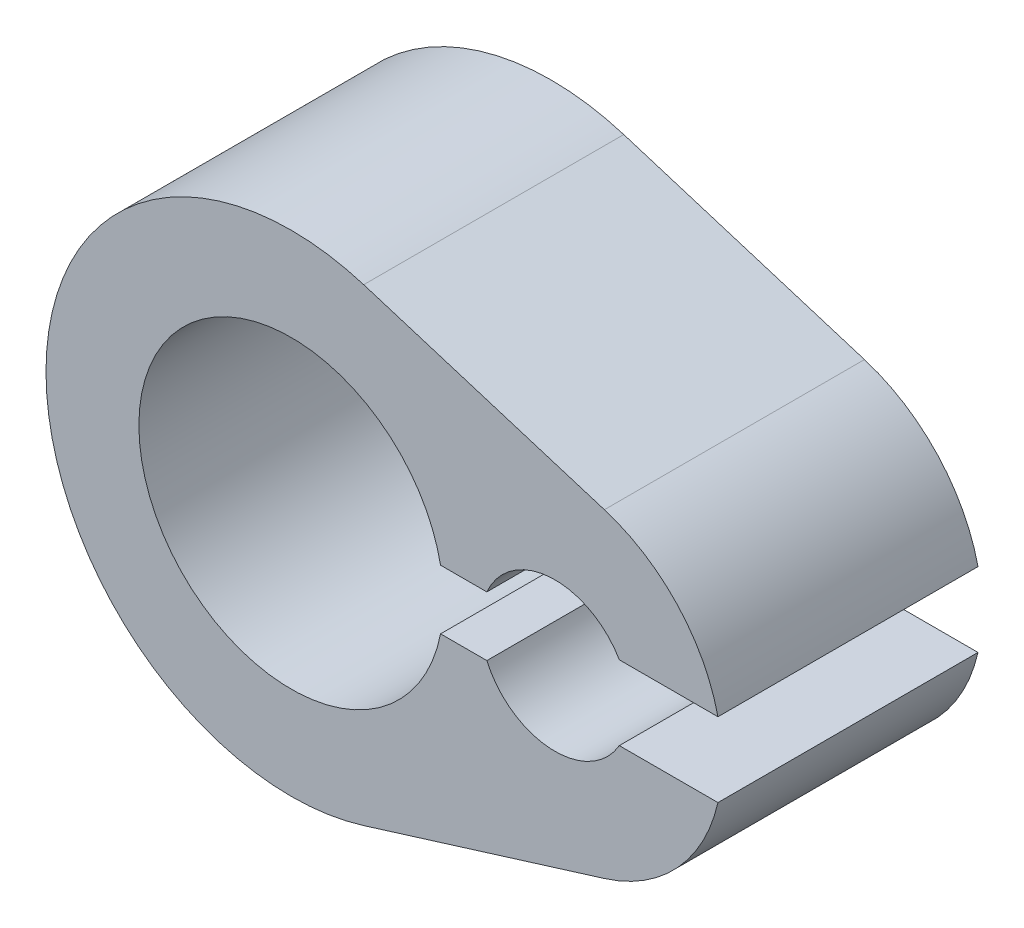
ISO-10303-21;
HEADER;
FILE_DESCRIPTION(('STEP AP214'),'2;1');
FILE_NAME('part.step','',(''),(''),'','','');
FILE_SCHEMA(('AUTOMOTIVE_DESIGN { 1 0 10303 214 1 1 1 1 }'));
ENDSEC;
DATA;
#1=APPLICATION_CONTEXT('core data for automotive mechanical design processes');
#2=APPLICATION_PROTOCOL_DEFINITION('international standard','automotive_design',2000,#1);
#3=PRODUCT_CONTEXT('',#1,'mechanical');
#4=PRODUCT('Part','Part','',(#3));
#5=PRODUCT_RELATED_PRODUCT_CATEGORY('part','',(#4));
#6=PRODUCT_DEFINITION_FORMATION('','',#4);
#7=PRODUCT_DEFINITION_CONTEXT('part definition',#1,'design');
#8=PRODUCT_DEFINITION('design','',#6,#7);
#9=PRODUCT_DEFINITION_SHAPE('','',#8);
#10=(LENGTH_UNIT() NAMED_UNIT(*) SI_UNIT(.MILLI.,.METRE.));
#11=(NAMED_UNIT(*) PLANE_ANGLE_UNIT() SI_UNIT($,.RADIAN.));
#12=(NAMED_UNIT(*) SI_UNIT($,.STERADIAN.) SOLID_ANGLE_UNIT());
#13=UNCERTAINTY_MEASURE_WITH_UNIT(LENGTH_MEASURE(1.E-05),#10,'distance_accuracy_value','');
#14=(GEOMETRIC_REPRESENTATION_CONTEXT(3) GLOBAL_UNCERTAINTY_ASSIGNED_CONTEXT((#13)) GLOBAL_UNIT_ASSIGNED_CONTEXT((#10,
#11,#12)) REPRESENTATION_CONTEXT('',''));
#15=CARTESIAN_POINT('',(0.,0.,0.));
#16=DIRECTION('',(0.,0.,1.));
#17=DIRECTION('',(1.,0.,0.));
#18=AXIS2_PLACEMENT_3D('',#15,#16,#17);
#19=CARTESIAN_POINT('',(7.1,0.,7.));
#20=DIRECTION('',(0.,0.,-1.));
#21=DIRECTION('',(-1.,0.,0.));
#22=AXIS2_PLACEMENT_3D('',#19,#20,#21);
#23=CYLINDRICAL_SURFACE('',#22,2.);
#24=CARTESIAN_POINT('',(7.1,0.,0.));
#25=DIRECTION('',(0.,0.,-1.));
#26=DIRECTION('',(1.,0.,0.));
#27=AXIS2_PLACEMENT_3D('',#24,#25,#26);
#28=CIRCLE('',#27,2.);
#29=CARTESIAN_POINT('',(5.26696972201766,0.8,0.));
#30=VERTEX_POINT('',#29);
#31=CARTESIAN_POINT('',(8.83205080756888,0.999999999999999,0.));
#32=VERTEX_POINT('',#31);
#33=EDGE_CURVE('E152',#30,#32,#28,.T.);
#34=ORIENTED_EDGE('',*,*,#33,.T.);
#35=DIRECTION('',(0.,0.,-1.));
#36=VECTOR('',#35,1.);
#37=CARTESIAN_POINT('',(8.83205080756888,0.999999999999999,7.));
#38=LINE('',#37,#36);
#39=CARTESIAN_POINT('',(8.83205080756888,0.999999999999999,7.));
#40=VERTEX_POINT('',#39);
#41=EDGE_CURVE('E11',#40,#32,#38,.T.);
#42=ORIENTED_EDGE('',*,*,#41,.F.);
#43=CARTESIAN_POINT('',(7.1,0.,7.));
#44=DIRECTION('',(0.,0.,-1.));
#45=DIRECTION('',(1.,0.,0.));
#46=AXIS2_PLACEMENT_3D('',#43,#44,#45);
#47=CIRCLE('',#46,2.);
#48=CARTESIAN_POINT('',(5.26696972201766,0.8,7.));
#49=VERTEX_POINT('',#48);
#50=EDGE_CURVE('E174',#49,#40,#47,.T.);
#51=ORIENTED_EDGE('',*,*,#50,.F.);
#52=DIRECTION('',(0.,0.,-1.));
#53=VECTOR('',#52,1.);
#54=CARTESIAN_POINT('',(5.26696972201766,0.8,7.));
#55=LINE('',#54,#53);
#56=EDGE_CURVE('E148',#49,#30,#55,.T.);
#57=ORIENTED_EDGE('',*,*,#56,.T.);
#58=EDGE_LOOP('',(#34,#42,#51,#57));
#59=FACE_BOUND('',#58,.T.);
#60=ADVANCED_FACE('F32',(#59),#23,.F.);
#61=CARTESIAN_POINT('',(8.83205080756888,0.999999999999999,7.));
#62=DIRECTION('',(0.,1.,0.));
#63=DIRECTION('',(-1.,0.,0.));
#64=AXIS2_PLACEMENT_3D('',#61,#62,#63);
#65=PLANE('',#64);
#66=DIRECTION('',(1.,0.,0.));
#67=VECTOR('',#66,1.);
#68=CARTESIAN_POINT('',(8.83205080756888,0.999999999999999,0.));
#69=LINE('',#68,#67);
#70=CARTESIAN_POINT('',(11.4874821936961,1.,0.));
#71=VERTEX_POINT('',#70);
#72=EDGE_CURVE('E155',#32,#71,#69,.T.);
#73=ORIENTED_EDGE('',*,*,#72,.T.);
#74=DIRECTION('',(0.,0.,-1.));
#75=VECTOR('',#74,1.);
#76=CARTESIAN_POINT('',(11.4874821936961,1.,7.));
#77=LINE('',#76,#75);
#78=CARTESIAN_POINT('',(11.4874821936961,1.,7.));
#79=VERTEX_POINT('',#78);
#80=EDGE_CURVE('E40',#79,#71,#77,.T.);
#81=ORIENTED_EDGE('',*,*,#80,.F.);
#82=DIRECTION('',(1.,0.,0.));
#83=VECTOR('',#82,1.);
#84=CARTESIAN_POINT('',(8.83205080756888,0.999999999999999,7.));
#85=LINE('',#84,#83);
#86=EDGE_CURVE('E103',#40,#79,#85,.T.);
#87=ORIENTED_EDGE('',*,*,#86,.F.);
#88=ORIENTED_EDGE('',*,*,#41,.T.);
#89=EDGE_LOOP('',(#73,#81,#87,#88));
#90=FACE_BOUND('',#89,.T.);
#91=ADVANCED_FACE('F252',(#90),#65,.F.);
#92=CARTESIAN_POINT('',(7.1,0.,7.));
#93=DIRECTION('',(0.,0.,-1.));
#94=DIRECTION('',(-1.,0.,0.));
#95=AXIS2_PLACEMENT_3D('',#92,#93,#94);
#96=CYLINDRICAL_SURFACE('',#95,4.5);
#97=CARTESIAN_POINT('',(7.1,0.,0.));
#98=DIRECTION('',(0.,0.,1.));
#99=DIRECTION('',(1.,0.,0.));
#100=AXIS2_PLACEMENT_3D('',#97,#98,#99);
#101=CIRCLE('',#100,4.5);
#102=CARTESIAN_POINT('',(8.43098591549296,4.29865984845968,0.));
#103=VERTEX_POINT('',#102);
#104=EDGE_CURVE('E157',#71,#103,#101,.T.);
#105=ORIENTED_EDGE('',*,*,#104,.T.);
#106=DIRECTION('',(0.,0.,-1.));
#107=VECTOR('',#106,1.);
#108=CARTESIAN_POINT('',(8.43098591549296,4.29865984845968,7.));
#109=LINE('',#108,#107);
#110=CARTESIAN_POINT('',(8.43098591549296,4.29865984845968,7.));
#111=VERTEX_POINT('',#110);
#112=EDGE_CURVE('E193',#111,#103,#109,.T.);
#113=ORIENTED_EDGE('',*,*,#112,.F.);
#114=CARTESIAN_POINT('',(7.1,0.,7.));
#115=DIRECTION('',(0.,0.,1.));
#116=DIRECTION('',(1.,0.,0.));
#117=AXIS2_PLACEMENT_3D('',#114,#115,#116);
#118=CIRCLE('',#117,4.5);
#119=EDGE_CURVE('E201',#79,#111,#118,.T.);
#120=ORIENTED_EDGE('',*,*,#119,.F.);
#121=ORIENTED_EDGE('',*,*,#80,.T.);
#122=EDGE_LOOP('',(#105,#113,#120,#121));
#123=FACE_BOUND('',#122,.T.);
#124=ADVANCED_FACE('F199',(#123),#96,.T.);
#125=CARTESIAN_POINT('',(1.95211267605634,6.30470111107419,7.));
#126=DIRECTION('',(-0.295774647887324,-0.95525774410215,0.));
#127=DIRECTION('',(0.955257744102151,-0.295774647887324,0.));
#128=AXIS2_PLACEMENT_3D('',#125,#126,#127);
#129=PLANE('',#128);
#130=DIRECTION('',(-0.95525774410215,0.295774647887324,0.));
#131=VECTOR('',#130,1.);
#132=CARTESIAN_POINT('',(1.95211267605634,6.30470111107419,0.));
#133=LINE('',#132,#131);
#134=CARTESIAN_POINT('',(1.95211267605634,6.30470111107419,0.));
#135=VERTEX_POINT('',#134);
#136=EDGE_CURVE('E159',#103,#135,#133,.T.);
#137=ORIENTED_EDGE('',*,*,#136,.T.);
#138=DIRECTION('',(0.,0.,-1.));
#139=VECTOR('',#138,1.);
#140=CARTESIAN_POINT('',(1.95211267605634,6.30470111107419,7.));
#141=LINE('',#140,#139);
#142=CARTESIAN_POINT('',(1.95211267605634,6.30470111107419,7.));
#143=VERTEX_POINT('',#142);
#144=EDGE_CURVE('E190',#143,#135,#141,.T.);
#145=ORIENTED_EDGE('',*,*,#144,.F.);
#146=DIRECTION('',(-0.95525774410215,0.295774647887324,0.));
#147=VECTOR('',#146,1.);
#148=CARTESIAN_POINT('',(1.95211267605634,6.30470111107419,7.));
#149=LINE('',#148,#147);
#150=EDGE_CURVE('E219',#111,#143,#149,.T.);
#151=ORIENTED_EDGE('',*,*,#150,.F.);
#152=ORIENTED_EDGE('',*,*,#112,.T.);
#153=EDGE_LOOP('',(#137,#145,#151,#152));
#154=FACE_BOUND('',#153,.T.);
#155=ADVANCED_FACE('F210',(#154),#129,.F.);
#156=CARTESIAN_POINT('',(0.,0.,7.));
#157=DIRECTION('',(0.,0.,-1.));
#158=DIRECTION('',(-1.,0.,0.));
#159=AXIS2_PLACEMENT_3D('',#156,#157,#158);
#160=CYLINDRICAL_SURFACE('',#159,6.6);
#161=CARTESIAN_POINT('',(0.,0.,0.));
#162=DIRECTION('',(0.,0.,1.));
#163=DIRECTION('',(1.,0.,0.));
#164=AXIS2_PLACEMENT_3D('',#161,#162,#163);
#165=CIRCLE('',#164,6.6);
#166=CARTESIAN_POINT('',(1.95211267605634,-6.30470111107419,0.));
#167=VERTEX_POINT('',#166);
#168=EDGE_CURVE('E161',#135,#167,#165,.T.);
#169=ORIENTED_EDGE('',*,*,#168,.T.);
#170=DIRECTION('',(0.,0.,-1.));
#171=VECTOR('',#170,1.);
#172=CARTESIAN_POINT('',(1.95211267605634,-6.30470111107419,7.));
#173=LINE('',#172,#171);
#174=CARTESIAN_POINT('',(1.95211267605634,-6.30470111107419,7.));
#175=VERTEX_POINT('',#174);
#176=EDGE_CURVE('E187',#175,#167,#173,.T.);
#177=ORIENTED_EDGE('',*,*,#176,.F.);
#178=CARTESIAN_POINT('',(0.,0.,7.));
#179=DIRECTION('',(0.,0.,1.));
#180=DIRECTION('',(1.,0.,0.));
#181=AXIS2_PLACEMENT_3D('',#178,#179,#180);
#182=CIRCLE('',#181,6.6);
#183=EDGE_CURVE('E216',#143,#175,#182,.T.);
#184=ORIENTED_EDGE('',*,*,#183,.F.);
#185=ORIENTED_EDGE('',*,*,#144,.T.);
#186=EDGE_LOOP('',(#169,#177,#184,#185));
#187=FACE_BOUND('',#186,.T.);
#188=ADVANCED_FACE('F214',(#187),#160,.T.);
#189=CARTESIAN_POINT('',(8.43098591549296,-4.29865984845967,7.));
#190=DIRECTION('',(-0.295774647887324,0.95525774410215,0.));
#191=DIRECTION('',(-0.95525774410215,-0.295774647887324,0.));
#192=AXIS2_PLACEMENT_3D('',#189,#190,#191);
#193=PLANE('',#192);
#194=DIRECTION('',(0.95525774410215,0.295774647887324,0.));
#195=VECTOR('',#194,1.);
#196=CARTESIAN_POINT('',(8.43098591549296,-4.29865984845967,0.));
#197=LINE('',#196,#195);
#198=CARTESIAN_POINT('',(8.43098591549296,-4.29865984845968,0.));
#199=VERTEX_POINT('',#198);
#200=EDGE_CURVE('E163',#167,#199,#197,.T.);
#201=ORIENTED_EDGE('',*,*,#200,.T.);
#202=DIRECTION('',(0.,0.,-1.));
#203=VECTOR('',#202,1.);
#204=CARTESIAN_POINT('',(8.43098591549296,-4.29865984845968,7.));
#205=LINE('',#204,#203);
#206=CARTESIAN_POINT('',(8.43098591549296,-4.29865984845968,7.));
#207=VERTEX_POINT('',#206);
#208=EDGE_CURVE('E184',#207,#199,#205,.T.);
#209=ORIENTED_EDGE('',*,*,#208,.F.);
#210=DIRECTION('',(0.95525774410215,0.295774647887324,0.));
#211=VECTOR('',#210,1.);
#212=CARTESIAN_POINT('',(8.43098591549296,-4.29865984845967,7.));
#213=LINE('',#212,#211);
#214=EDGE_CURVE('E218',#175,#207,#213,.T.);
#215=ORIENTED_EDGE('',*,*,#214,.F.);
#216=ORIENTED_EDGE('',*,*,#176,.T.);
#217=EDGE_LOOP('',(#201,#209,#215,#216));
#218=FACE_BOUND('',#217,.T.);
#219=ADVANCED_FACE('F265',(#218),#193,.F.);
#220=CARTESIAN_POINT('',(7.1,0.,7.));
#221=DIRECTION('',(0.,0.,-1.));
#222=DIRECTION('',(-1.,0.,0.));
#223=AXIS2_PLACEMENT_3D('',#220,#221,#222);
#224=CYLINDRICAL_SURFACE('',#223,4.5);
#225=CARTESIAN_POINT('',(7.1,0.,0.));
#226=DIRECTION('',(0.,0.,1.));
#227=DIRECTION('',(1.,0.,0.));
#228=AXIS2_PLACEMENT_3D('',#225,#226,#227);
#229=CIRCLE('',#228,4.5);
#230=CARTESIAN_POINT('',(11.4874821936961,-0.999999999999999,0.));
#231=VERTEX_POINT('',#230);
#232=EDGE_CURVE('E165',#199,#231,#229,.T.);
#233=ORIENTED_EDGE('',*,*,#232,.T.);
#234=DIRECTION('',(0.,0.,-1.));
#235=VECTOR('',#234,1.);
#236=CARTESIAN_POINT('',(11.4874821936961,-0.999999999999999,7.));
#237=LINE('',#236,#235);
#238=CARTESIAN_POINT('',(11.4874821936961,-0.999999999999999,7.));
#239=VERTEX_POINT('',#238);
#240=EDGE_CURVE('E181',#239,#231,#237,.T.);
#241=ORIENTED_EDGE('',*,*,#240,.F.);
#242=CARTESIAN_POINT('',(7.1,0.,7.));
#243=DIRECTION('',(0.,0.,1.));
#244=DIRECTION('',(1.,0.,0.));
#245=AXIS2_PLACEMENT_3D('',#242,#243,#244);
#246=CIRCLE('',#245,4.5);
#247=EDGE_CURVE('E221',#207,#239,#246,.T.);
#248=ORIENTED_EDGE('',*,*,#247,.F.);
#249=ORIENTED_EDGE('',*,*,#208,.T.);
#250=EDGE_LOOP('',(#233,#241,#248,#249));
#251=FACE_BOUND('',#250,.T.);
#252=ADVANCED_FACE('F268',(#251),#224,.T.);
#253=CARTESIAN_POINT('',(11.4874821936961,-0.999999999999999,7.));
#254=DIRECTION('',(0.,-1.,0.));
#255=DIRECTION('',(1.,0.,0.));
#256=AXIS2_PLACEMENT_3D('',#253,#254,#255);
#257=PLANE('',#256);
#258=DIRECTION('',(-1.,0.,0.));
#259=VECTOR('',#258,1.);
#260=CARTESIAN_POINT('',(11.4874821936961,-0.999999999999999,0.));
#261=LINE('',#260,#259);
#262=CARTESIAN_POINT('',(8.83205080756888,-1.,0.));
#263=VERTEX_POINT('',#262);
#264=EDGE_CURVE('E167',#231,#263,#261,.T.);
#265=ORIENTED_EDGE('',*,*,#264,.T.);
#266=DIRECTION('',(0.,0.,-1.));
#267=VECTOR('',#266,1.);
#268=CARTESIAN_POINT('',(8.83205080756888,-1.,7.));
#269=LINE('',#268,#267);
#270=CARTESIAN_POINT('',(8.83205080756888,-1.,7.));
#271=VERTEX_POINT('',#270);
#272=EDGE_CURVE('E178',#271,#263,#269,.T.);
#273=ORIENTED_EDGE('',*,*,#272,.F.);
#274=DIRECTION('',(-1.,0.,0.));
#275=VECTOR('',#274,1.);
#276=CARTESIAN_POINT('',(11.4874821936961,-0.999999999999999,7.));
#277=LINE('',#276,#275);
#278=EDGE_CURVE('E227',#239,#271,#277,.T.);
#279=ORIENTED_EDGE('',*,*,#278,.F.);
#280=ORIENTED_EDGE('',*,*,#240,.T.);
#281=EDGE_LOOP('',(#265,#273,#279,#280));
#282=FACE_BOUND('',#281,.T.);
#283=ADVANCED_FACE('F233',(#282),#257,.F.);
#284=CARTESIAN_POINT('',(7.1,0.,7.));
#285=DIRECTION('',(0.,0.,-1.));
#286=DIRECTION('',(-1.,0.,0.));
#287=AXIS2_PLACEMENT_3D('',#284,#285,#286);
#288=CYLINDRICAL_SURFACE('',#287,2.);
#289=CARTESIAN_POINT('',(7.1,0.,0.));
#290=DIRECTION('',(0.,0.,-1.));
#291=DIRECTION('',(1.,0.,0.));
#292=AXIS2_PLACEMENT_3D('',#289,#290,#291);
#293=CIRCLE('',#292,2.);
#294=CARTESIAN_POINT('',(5.26696972201766,-0.8,0.));
#295=VERTEX_POINT('',#294);
#296=EDGE_CURVE('E169',#263,#295,#293,.T.);
#297=ORIENTED_EDGE('',*,*,#296,.T.);
#298=DIRECTION('',(0.,0.,-1.));
#299=VECTOR('',#298,1.);
#300=CARTESIAN_POINT('',(5.26696972201766,-0.8,7.));
#301=LINE('',#300,#299);
#302=CARTESIAN_POINT('',(5.26696972201766,-0.8,7.));
#303=VERTEX_POINT('',#302);
#304=EDGE_CURVE('E143',#303,#295,#301,.T.);
#305=ORIENTED_EDGE('',*,*,#304,.F.);
#306=CARTESIAN_POINT('',(7.1,0.,7.));
#307=DIRECTION('',(0.,0.,-1.));
#308=DIRECTION('',(1.,0.,0.));
#309=AXIS2_PLACEMENT_3D('',#306,#307,#308);
#310=CIRCLE('',#309,2.);
#311=EDGE_CURVE('E134',#271,#303,#310,.T.);
#312=ORIENTED_EDGE('',*,*,#311,.F.);
#313=ORIENTED_EDGE('',*,*,#272,.T.);
#314=EDGE_LOOP('',(#297,#305,#312,#313));
#315=FACE_BOUND('',#314,.T.);
#316=ADVANCED_FACE('F237',(#315),#288,.F.);
#317=CARTESIAN_POINT('',(4.02119385257662,-0.8,7.));
#318=DIRECTION('',(0.,-1.,0.));
#319=DIRECTION('',(1.,0.,0.));
#320=AXIS2_PLACEMENT_3D('',#317,#318,#319);
#321=PLANE('',#320);
#322=DIRECTION('',(-1.,0.,0.));
#323=VECTOR('',#322,1.);
#324=CARTESIAN_POINT('',(4.02119385257662,-0.8,0.));
#325=LINE('',#324,#323);
#326=CARTESIAN_POINT('',(4.02119385257662,-0.800000000000001,0.));
#327=VERTEX_POINT('',#326);
#328=EDGE_CURVE('E142',#295,#327,#325,.T.);
#329=ORIENTED_EDGE('',*,*,#328,.T.);
#330=DIRECTION('',(0.,0.,-1.));
#331=VECTOR('',#330,1.);
#332=CARTESIAN_POINT('',(4.02119385257662,-0.800000000000001,7.));
#333=LINE('',#332,#331);
#334=CARTESIAN_POINT('',(4.02119385257662,-0.800000000000001,7.));
#335=VERTEX_POINT('',#334);
#336=EDGE_CURVE('E139',#335,#327,#333,.T.);
#337=ORIENTED_EDGE('',*,*,#336,.F.);
#338=DIRECTION('',(-1.,0.,0.));
#339=VECTOR('',#338,1.);
#340=CARTESIAN_POINT('',(4.02119385257662,-0.8,7.));
#341=LINE('',#340,#339);
#342=EDGE_CURVE('E128',#303,#335,#341,.T.);
#343=ORIENTED_EDGE('',*,*,#342,.F.);
#344=ORIENTED_EDGE('',*,*,#304,.T.);
#345=EDGE_LOOP('',(#329,#337,#343,#344));
#346=FACE_BOUND('',#345,.T.);
#347=ADVANCED_FACE('F140',(#346),#321,.F.);
#348=CARTESIAN_POINT('',(0.,0.,7.));
#349=DIRECTION('',(0.,0.,-1.));
#350=DIRECTION('',(-1.,0.,0.));
#351=AXIS2_PLACEMENT_3D('',#348,#349,#350);
#352=CYLINDRICAL_SURFACE('',#351,4.1);
#353=CARTESIAN_POINT('',(0.,0.,0.));
#354=DIRECTION('',(0.,0.,-1.));
#355=DIRECTION('',(1.,0.,0.));
#356=AXIS2_PLACEMENT_3D('',#353,#354,#355);
#357=CIRCLE('',#356,4.1);
#358=CARTESIAN_POINT('',(4.02119385257662,0.8,0.));
#359=VERTEX_POINT('',#358);
#360=EDGE_CURVE('E89',#327,#359,#357,.T.);
#361=ORIENTED_EDGE('',*,*,#360,.T.);
#362=DIRECTION('',(0.,0.,-1.));
#363=VECTOR('',#362,1.);
#364=CARTESIAN_POINT('',(4.02119385257662,0.8,7.));
#365=LINE('',#364,#363);
#366=CARTESIAN_POINT('',(4.02119385257662,0.8,7.));
#367=VERTEX_POINT('',#366);
#368=EDGE_CURVE('E144',#367,#359,#365,.T.);
#369=ORIENTED_EDGE('',*,*,#368,.F.);
#370=CARTESIAN_POINT('',(0.,0.,7.));
#371=DIRECTION('',(0.,0.,-1.));
#372=DIRECTION('',(1.,0.,0.));
#373=AXIS2_PLACEMENT_3D('',#370,#371,#372);
#374=CIRCLE('',#373,4.1);
#375=EDGE_CURVE('E132',#335,#367,#374,.T.);
#376=ORIENTED_EDGE('',*,*,#375,.F.);
#377=ORIENTED_EDGE('',*,*,#336,.T.);
#378=EDGE_LOOP('',(#361,#369,#376,#377));
#379=FACE_BOUND('',#378,.T.);
#380=ADVANCED_FACE('F146',(#379),#352,.F.);
#381=CARTESIAN_POINT('',(4.02119385257662,0.8,7.));
#382=DIRECTION('',(0.,1.,0.));
#383=DIRECTION('',(-1.,0.,0.));
#384=AXIS2_PLACEMENT_3D('',#381,#382,#383);
#385=PLANE('',#384);
#386=DIRECTION('',(1.,0.,0.));
#387=VECTOR('',#386,1.);
#388=CARTESIAN_POINT('',(4.02119385257662,0.8,0.));
#389=LINE('',#388,#387);
#390=EDGE_CURVE('E95',#359,#30,#389,.T.);
#391=ORIENTED_EDGE('',*,*,#390,.T.);
#392=ORIENTED_EDGE('',*,*,#56,.F.);
#393=DIRECTION('',(1.,0.,0.));
#394=VECTOR('',#393,1.);
#395=CARTESIAN_POINT('',(4.02119385257662,0.8,7.));
#396=LINE('',#395,#394);
#397=EDGE_CURVE('E48',#367,#49,#396,.T.);
#398=ORIENTED_EDGE('',*,*,#397,.F.);
#399=ORIENTED_EDGE('',*,*,#368,.T.);
#400=EDGE_LOOP('',(#391,#392,#398,#399));
#401=FACE_BOUND('',#400,.T.);
#402=ADVANCED_FACE('F241',(#401),#385,.F.);
#403=CARTESIAN_POINT('',(7.1,0.,7.));
#404=DIRECTION('',(0.,0.,1.));
#405=DIRECTION('',(1.,0.,0.));
#406=AXIS2_PLACEMENT_3D('',#403,#404,#405);
#407=PLANE('',#406);
#408=ORIENTED_EDGE('',*,*,#50,.T.);
#409=ORIENTED_EDGE('',*,*,#86,.T.);
#410=ORIENTED_EDGE('',*,*,#119,.T.);
#411=ORIENTED_EDGE('',*,*,#150,.T.);
#412=ORIENTED_EDGE('',*,*,#183,.T.);
#413=ORIENTED_EDGE('',*,*,#214,.T.);
#414=ORIENTED_EDGE('',*,*,#247,.T.);
#415=ORIENTED_EDGE('',*,*,#278,.T.);
#416=ORIENTED_EDGE('',*,*,#311,.T.);
#417=ORIENTED_EDGE('',*,*,#342,.T.);
#418=ORIENTED_EDGE('',*,*,#375,.T.);
#419=ORIENTED_EDGE('',*,*,#397,.T.);
#420=EDGE_LOOP('',(#408,#409,#410,#411,#412,#413,#414,#415,#416,#417,#418,#419));
#421=FACE_BOUND('',#420,.T.);
#422=ADVANCED_FACE('F130',(#421),#407,.T.);
#423=CARTESIAN_POINT('',(7.1,0.,0.));
#424=DIRECTION('',(0.,0.,1.));
#425=DIRECTION('',(1.,0.,0.));
#426=AXIS2_PLACEMENT_3D('',#423,#424,#425);
#427=PLANE('',#426);
#428=ORIENTED_EDGE('',*,*,#33,.F.);
#429=ORIENTED_EDGE('',*,*,#390,.F.);
#430=ORIENTED_EDGE('',*,*,#360,.F.);
#431=ORIENTED_EDGE('',*,*,#328,.F.);
#432=ORIENTED_EDGE('',*,*,#296,.F.);
#433=ORIENTED_EDGE('',*,*,#264,.F.);
#434=ORIENTED_EDGE('',*,*,#232,.F.);
#435=ORIENTED_EDGE('',*,*,#200,.F.);
#436=ORIENTED_EDGE('',*,*,#168,.F.);
#437=ORIENTED_EDGE('',*,*,#136,.F.);
#438=ORIENTED_EDGE('',*,*,#104,.F.);
#439=ORIENTED_EDGE('',*,*,#72,.F.);
#440=EDGE_LOOP('',(#428,#429,#430,#431,#432,#433,#434,#435,#436,#437,#438,#439));
#441=FACE_BOUND('',#440,.T.);
#442=ADVANCED_FACE('F205',(#441),#427,.F.);
#443=CLOSED_SHELL('',(#60,#91,#124,#155,#188,#219,#252,#283,#316,#347,#380,#402,#422,#442));
#444=MANIFOLD_SOLID_BREP('B2',#443);
#445=ADVANCED_BREP_SHAPE_REPRESENTATION('',(#18,#444),#14);
#446=SHAPE_DEFINITION_REPRESENTATION(#9,#445);
ENDSEC;
END-ISO-10303-21;
